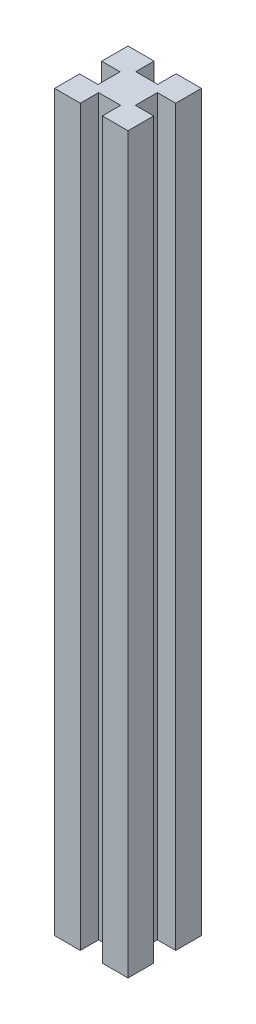
ISO-10303-21;
HEADER;
FILE_DESCRIPTION(('STEP AP214'),'2;1');
FILE_NAME('part.step','',(''),(''),'','','');
FILE_SCHEMA(('AUTOMOTIVE_DESIGN { 1 0 10303 214 1 1 1 1 }'));
ENDSEC;
DATA;
#1=APPLICATION_CONTEXT('core data for automotive mechanical design processes');
#2=APPLICATION_PROTOCOL_DEFINITION('international standard','automotive_design',2000,#1);
#3=PRODUCT_CONTEXT('',#1,'mechanical');
#4=PRODUCT('Part','Part','',(#3));
#5=PRODUCT_RELATED_PRODUCT_CATEGORY('part','',(#4));
#6=PRODUCT_DEFINITION_FORMATION('','',#4);
#7=PRODUCT_DEFINITION_CONTEXT('part definition',#1,'design');
#8=PRODUCT_DEFINITION('design','',#6,#7);
#9=PRODUCT_DEFINITION_SHAPE('','',#8);
#10=(LENGTH_UNIT() NAMED_UNIT(*) SI_UNIT(.MILLI.,.METRE.));
#11=(NAMED_UNIT(*) PLANE_ANGLE_UNIT() SI_UNIT($,.RADIAN.));
#12=(NAMED_UNIT(*) SI_UNIT($,.STERADIAN.) SOLID_ANGLE_UNIT());
#13=UNCERTAINTY_MEASURE_WITH_UNIT(LENGTH_MEASURE(1.E-05),#10,'distance_accuracy_value','');
#14=(GEOMETRIC_REPRESENTATION_CONTEXT(3) GLOBAL_UNCERTAINTY_ASSIGNED_CONTEXT((#13)) GLOBAL_UNIT_ASSIGNED_CONTEXT((#10,
#11,#12)) REPRESENTATION_CONTEXT('',''));
#15=CARTESIAN_POINT('',(0.,0.,0.));
#16=DIRECTION('',(0.,0.,1.));
#17=DIRECTION('',(1.,0.,0.));
#18=AXIS2_PLACEMENT_3D('',#15,#16,#17);
#19=CARTESIAN_POINT('',(0.,200.,0.));
#20=DIRECTION('',(1.,0.,0.));
#21=DIRECTION('',(0.,0.,-1.));
#22=AXIS2_PLACEMENT_3D('',#19,#20,#21);
#23=PLANE('',#22);
#24=DIRECTION('',(0.,1.,0.));
#25=VECTOR('',#24,1.);
#26=CARTESIAN_POINT('',(0.,0.,7.17807488292443));
#27=LINE('',#26,#25);
#28=CARTESIAN_POINT('',(0.,0.,7.17807488292443));
#29=VERTEX_POINT('',#28);
#30=CARTESIAN_POINT('',(0.,200.,7.17807488292443));
#31=VERTEX_POINT('',#30);
#32=EDGE_CURVE('E372',#29,#31,#27,.T.);
#33=ORIENTED_EDGE('',*,*,#32,.T.);
#34=DIRECTION('',(0.,0.,1.));
#35=VECTOR('',#34,1.);
#36=CARTESIAN_POINT('',(0.,200.,0.));
#37=LINE('',#36,#35);
#38=CARTESIAN_POINT('',(0.,200.,0.));
#39=VERTEX_POINT('',#38);
#40=EDGE_CURVE('E312',#39,#31,#37,.T.);
#41=ORIENTED_EDGE('',*,*,#40,.F.);
#42=DIRECTION('',(0.,-1.,0.));
#43=VECTOR('',#42,1.);
#44=CARTESIAN_POINT('',(0.,200.,0.));
#45=LINE('',#44,#43);
#46=CARTESIAN_POINT('',(0.,0.,0.));
#47=VERTEX_POINT('',#46);
#48=EDGE_CURVE('E219',#39,#47,#45,.T.);
#49=ORIENTED_EDGE('',*,*,#48,.T.);
#50=DIRECTION('',(0.,0.,1.));
#51=VECTOR('',#50,1.);
#52=CARTESIAN_POINT('',(0.,0.,0.));
#53=LINE('',#52,#51);
#54=EDGE_CURVE('E205',#47,#29,#53,.T.);
#55=ORIENTED_EDGE('',*,*,#54,.T.);
#56=EDGE_LOOP('',(#33,#41,#49,#55));
#57=FACE_BOUND('',#56,.T.);
#58=ADVANCED_FACE('F39',(#57),#23,.F.);
#59=CARTESIAN_POINT('',(0.,200.,20.));
#60=DIRECTION('',(0.,0.,-1.));
#61=DIRECTION('',(-1.,0.,0.));
#62=AXIS2_PLACEMENT_3D('',#59,#60,#61);
#63=PLANE('',#62);
#64=DIRECTION('',(0.,1.,0.));
#65=VECTOR('',#64,1.);
#66=CARTESIAN_POINT('',(7.,0.,20.));
#67=LINE('',#66,#65);
#68=CARTESIAN_POINT('',(7.,0.,20.));
#69=VERTEX_POINT('',#68);
#70=CARTESIAN_POINT('',(7.,200.,20.));
#71=VERTEX_POINT('',#70);
#72=EDGE_CURVE('E262',#69,#71,#67,.T.);
#73=ORIENTED_EDGE('',*,*,#72,.T.);
#74=DIRECTION('',(1.,0.,0.));
#75=VECTOR('',#74,1.);
#76=CARTESIAN_POINT('',(0.,200.,20.));
#77=LINE('',#76,#75);
#78=CARTESIAN_POINT('',(0.,200.,20.));
#79=VERTEX_POINT('',#78);
#80=EDGE_CURVE('E317',#79,#71,#77,.T.);
#81=ORIENTED_EDGE('',*,*,#80,.F.);
#82=DIRECTION('',(0.,-1.,0.));
#83=VECTOR('',#82,1.);
#84=CARTESIAN_POINT('',(0.,200.,20.));
#85=LINE('',#84,#83);
#86=CARTESIAN_POINT('',(0.,0.,20.));
#87=VERTEX_POINT('',#86);
#88=EDGE_CURVE('E11',#79,#87,#85,.T.);
#89=ORIENTED_EDGE('',*,*,#88,.T.);
#90=DIRECTION('',(1.,0.,0.));
#91=VECTOR('',#90,1.);
#92=CARTESIAN_POINT('',(0.,0.,20.));
#93=LINE('',#92,#91);
#94=EDGE_CURVE('E329',#87,#69,#93,.T.);
#95=ORIENTED_EDGE('',*,*,#94,.T.);
#96=EDGE_LOOP('',(#73,#81,#89,#95));
#97=FACE_BOUND('',#96,.T.);
#98=ADVANCED_FACE('F353',(#97),#63,.F.);
#99=CARTESIAN_POINT('',(20.,200.,0.));
#100=DIRECTION('',(-1.,0.,0.));
#101=DIRECTION('',(0.,0.,1.));
#102=AXIS2_PLACEMENT_3D('',#99,#100,#101);
#103=PLANE('',#102);
#104=DIRECTION('',(0.,1.,0.));
#105=VECTOR('',#104,1.);
#106=CARTESIAN_POINT('',(20.,0.,13.));
#107=LINE('',#106,#105);
#108=CARTESIAN_POINT('',(20.,0.,13.));
#109=VERTEX_POINT('',#108);
#110=CARTESIAN_POINT('',(20.,200.,13.));
#111=VERTEX_POINT('',#110);
#112=EDGE_CURVE('E273',#109,#111,#107,.T.);
#113=ORIENTED_EDGE('',*,*,#112,.T.);
#114=DIRECTION('',(0.,0.,-1.));
#115=VECTOR('',#114,1.);
#116=CARTESIAN_POINT('',(20.,200.,0.));
#117=LINE('',#116,#115);
#118=CARTESIAN_POINT('',(20.,200.,20.));
#119=VERTEX_POINT('',#118);
#120=EDGE_CURVE('E235',#119,#111,#117,.T.);
#121=ORIENTED_EDGE('',*,*,#120,.F.);
#122=DIRECTION('',(0.,-1.,0.));
#123=VECTOR('',#122,1.);
#124=CARTESIAN_POINT('',(20.,200.,20.));
#125=LINE('',#124,#123);
#126=CARTESIAN_POINT('',(20.,0.,20.));
#127=VERTEX_POINT('',#126);
#128=EDGE_CURVE('E48',#119,#127,#125,.T.);
#129=ORIENTED_EDGE('',*,*,#128,.T.);
#130=DIRECTION('',(0.,0.,-1.));
#131=VECTOR('',#130,1.);
#132=CARTESIAN_POINT('',(20.,0.,0.));
#133=LINE('',#132,#131);
#134=EDGE_CURVE('E208',#127,#109,#133,.T.);
#135=ORIENTED_EDGE('',*,*,#134,.T.);
#136=EDGE_LOOP('',(#113,#121,#129,#135));
#137=FACE_BOUND('',#136,.T.);
#138=ADVANCED_FACE('F233',(#137),#103,.F.);
#139=CARTESIAN_POINT('',(0.,200.,0.));
#140=DIRECTION('',(0.,0.,1.));
#141=DIRECTION('',(1.,0.,0.));
#142=AXIS2_PLACEMENT_3D('',#139,#140,#141);
#143=PLANE('',#142);
#144=DIRECTION('',(0.,1.,0.));
#145=VECTOR('',#144,1.);
#146=CARTESIAN_POINT('',(13.1122464142237,0.,0.));
#147=LINE('',#146,#145);
#148=CARTESIAN_POINT('',(13.1122464142237,0.,0.));
#149=VERTEX_POINT('',#148);
#150=CARTESIAN_POINT('',(13.1122464142237,200.,0.));
#151=VERTEX_POINT('',#150);
#152=EDGE_CURVE('E443',#149,#151,#147,.T.);
#153=ORIENTED_EDGE('',*,*,#152,.T.);
#154=DIRECTION('',(-1.,0.,0.));
#155=VECTOR('',#154,1.);
#156=CARTESIAN_POINT('',(0.,200.,0.));
#157=LINE('',#156,#155);
#158=CARTESIAN_POINT('',(20.,200.,0.));
#159=VERTEX_POINT('',#158);
#160=EDGE_CURVE('E223',#159,#151,#157,.T.);
#161=ORIENTED_EDGE('',*,*,#160,.F.);
#162=DIRECTION('',(0.,-1.,0.));
#163=VECTOR('',#162,1.);
#164=CARTESIAN_POINT('',(20.,200.,0.));
#165=LINE('',#164,#163);
#166=CARTESIAN_POINT('',(20.,0.,0.));
#167=VERTEX_POINT('',#166);
#168=EDGE_CURVE('E222',#159,#167,#165,.T.);
#169=ORIENTED_EDGE('',*,*,#168,.T.);
#170=DIRECTION('',(-1.,0.,0.));
#171=VECTOR('',#170,1.);
#172=CARTESIAN_POINT('',(0.,0.,0.));
#173=LINE('',#172,#171);
#174=EDGE_CURVE('E207',#167,#149,#173,.T.);
#175=ORIENTED_EDGE('',*,*,#174,.T.);
#176=EDGE_LOOP('',(#153,#161,#169,#175));
#177=FACE_BOUND('',#176,.T.);
#178=ADVANCED_FACE('F426',(#177),#143,.F.);
#179=CARTESIAN_POINT('',(0.,200.,0.));
#180=DIRECTION('',(0.,1.,0.));
#181=DIRECTION('',(0.,0.,1.));
#182=AXIS2_PLACEMENT_3D('',#179,#180,#181);
#183=PLANE('',#182);
#184=ORIENTED_EDGE('',*,*,#160,.T.);
#185=DIRECTION('',(0.,0.,1.));
#186=VECTOR('',#185,1.);
#187=CARTESIAN_POINT('',(13.1122464142237,200.,0.));
#188=LINE('',#187,#186);
#189=CARTESIAN_POINT('',(13.1122464142237,200.,5.));
#190=VERTEX_POINT('',#189);
#191=EDGE_CURVE('E188',#151,#190,#188,.T.);
#192=ORIENTED_EDGE('',*,*,#191,.T.);
#193=DIRECTION('',(1.,0.,0.));
#194=VECTOR('',#193,1.);
#195=CARTESIAN_POINT('',(0.,200.,5.));
#196=LINE('',#195,#194);
#197=CARTESIAN_POINT('',(7.11224641422371,200.,5.));
#198=VERTEX_POINT('',#197);
#199=EDGE_CURVE('E475',#198,#190,#196,.T.);
#200=ORIENTED_EDGE('',*,*,#199,.F.);
#201=DIRECTION('',(0.,0.,1.));
#202=VECTOR('',#201,1.);
#203=CARTESIAN_POINT('',(7.11224641422371,200.,0.));
#204=LINE('',#203,#202);
#205=CARTESIAN_POINT('',(7.11224641422371,200.,0.));
#206=VERTEX_POINT('',#205);
#207=EDGE_CURVE('E369',#206,#198,#204,.T.);
#208=ORIENTED_EDGE('',*,*,#207,.F.);
#209=EDGE_CURVE('E196',#206,#39,#157,.T.);
#210=ORIENTED_EDGE('',*,*,#209,.T.);
#211=ORIENTED_EDGE('',*,*,#40,.T.);
#212=DIRECTION('',(1.,0.,0.));
#213=VECTOR('',#212,1.);
#214=CARTESIAN_POINT('',(0.,200.,7.17807488292443));
#215=LINE('',#214,#213);
#216=CARTESIAN_POINT('',(5.,200.,7.17807488292443));
#217=VERTEX_POINT('',#216);
#218=EDGE_CURVE('E467',#31,#217,#215,.T.);
#219=ORIENTED_EDGE('',*,*,#218,.T.);
#220=DIRECTION('',(0.,0.,1.));
#221=VECTOR('',#220,1.);
#222=CARTESIAN_POINT('',(5.,200.,0.));
#223=LINE('',#222,#221);
#224=CARTESIAN_POINT('',(5.,200.,13.1780748829244));
#225=VERTEX_POINT('',#224);
#226=EDGE_CURVE('E272',#217,#225,#223,.T.);
#227=ORIENTED_EDGE('',*,*,#226,.T.);
#228=DIRECTION('',(1.,0.,0.));
#229=VECTOR('',#228,1.);
#230=CARTESIAN_POINT('',(0.,200.,13.1780748829244));
#231=LINE('',#230,#229);
#232=CARTESIAN_POINT('',(0.,200.,13.1780748829244));
#233=VERTEX_POINT('',#232);
#234=EDGE_CURVE('E359',#233,#225,#231,.T.);
#235=ORIENTED_EDGE('',*,*,#234,.F.);
#236=EDGE_CURVE('E213',#233,#79,#37,.T.);
#237=ORIENTED_EDGE('',*,*,#236,.T.);
#238=ORIENTED_EDGE('',*,*,#80,.T.);
#239=DIRECTION('',(0.,0.,-1.));
#240=VECTOR('',#239,1.);
#241=CARTESIAN_POINT('',(7.,200.,0.));
#242=LINE('',#241,#240);
#243=CARTESIAN_POINT('',(7.,200.,15.));
#244=VERTEX_POINT('',#243);
#245=EDGE_CURVE('E282',#71,#244,#242,.T.);
#246=ORIENTED_EDGE('',*,*,#245,.T.);
#247=DIRECTION('',(1.,0.,0.));
#248=VECTOR('',#247,1.);
#249=CARTESIAN_POINT('',(0.,200.,15.));
#250=LINE('',#249,#248);
#251=CARTESIAN_POINT('',(13.,200.,15.));
#252=VERTEX_POINT('',#251);
#253=EDGE_CURVE('E294',#244,#252,#250,.T.);
#254=ORIENTED_EDGE('',*,*,#253,.T.);
#255=DIRECTION('',(0.,0.,-1.));
#256=VECTOR('',#255,1.);
#257=CARTESIAN_POINT('',(13.,200.,0.));
#258=LINE('',#257,#256);
#259=CARTESIAN_POINT('',(13.,200.,20.));
#260=VERTEX_POINT('',#259);
#261=EDGE_CURVE('E290',#260,#252,#258,.T.);
#262=ORIENTED_EDGE('',*,*,#261,.F.);
#263=EDGE_CURVE('E316',#260,#119,#77,.T.);
#264=ORIENTED_EDGE('',*,*,#263,.T.);
#265=ORIENTED_EDGE('',*,*,#120,.T.);
#266=DIRECTION('',(-1.,0.,0.));
#267=VECTOR('',#266,1.);
#268=CARTESIAN_POINT('',(0.,200.,13.));
#269=LINE('',#268,#267);
#270=CARTESIAN_POINT('',(15.,200.,13.));
#271=VERTEX_POINT('',#270);
#272=EDGE_CURVE('E265',#111,#271,#269,.T.);
#273=ORIENTED_EDGE('',*,*,#272,.T.);
#274=DIRECTION('',(0.,0.,1.));
#275=VECTOR('',#274,1.);
#276=CARTESIAN_POINT('',(15.,200.,0.));
#277=LINE('',#276,#275);
#278=CARTESIAN_POINT('',(15.,200.,7.));
#279=VERTEX_POINT('',#278);
#280=EDGE_CURVE('E261',#279,#271,#277,.T.);
#281=ORIENTED_EDGE('',*,*,#280,.F.);
#282=DIRECTION('',(-1.,0.,0.));
#283=VECTOR('',#282,1.);
#284=CARTESIAN_POINT('',(0.,200.,7.));
#285=LINE('',#284,#283);
#286=CARTESIAN_POINT('',(20.,200.,7.));
#287=VERTEX_POINT('',#286);
#288=EDGE_CURVE('E257',#287,#279,#285,.T.);
#289=ORIENTED_EDGE('',*,*,#288,.F.);
#290=EDGE_CURVE('E321',#287,#159,#117,.T.);
#291=ORIENTED_EDGE('',*,*,#290,.T.);
#292=EDGE_LOOP('',(#184,#192,#200,#208,#210,#211,#219,#227,#235,#237,#238,#246,#254,#262,#264,
#265,#273,#281,#289,#291));
#293=FACE_BOUND('',#292,.T.);
#294=ADVANCED_FACE('F342',(#293),#183,.T.);
#295=CARTESIAN_POINT('',(0.,0.,0.));
#296=DIRECTION('',(0.,1.,0.));
#297=DIRECTION('',(0.,0.,1.));
#298=AXIS2_PLACEMENT_3D('',#295,#296,#297);
#299=PLANE('',#298);
#300=DIRECTION('',(0.,0.,1.));
#301=VECTOR('',#300,1.);
#302=CARTESIAN_POINT('',(13.1122464142237,0.,0.));
#303=LINE('',#302,#301);
#304=CARTESIAN_POINT('',(13.1122464142237,0.,5.));
#305=VERTEX_POINT('',#304);
#306=EDGE_CURVE('E198',#149,#305,#303,.T.);
#307=ORIENTED_EDGE('',*,*,#306,.F.);
#308=ORIENTED_EDGE('',*,*,#174,.F.);
#309=CARTESIAN_POINT('',(20.,0.,7.));
#310=VERTEX_POINT('',#309);
#311=EDGE_CURVE('E215',#310,#167,#133,.T.);
#312=ORIENTED_EDGE('',*,*,#311,.F.);
#313=DIRECTION('',(-1.,0.,0.));
#314=VECTOR('',#313,1.);
#315=CARTESIAN_POINT('',(0.,0.,7.));
#316=LINE('',#315,#314);
#317=CARTESIAN_POINT('',(15.,0.,7.));
#318=VERTEX_POINT('',#317);
#319=EDGE_CURVE('E253',#310,#318,#316,.T.);
#320=ORIENTED_EDGE('',*,*,#319,.T.);
#321=DIRECTION('',(0.,0.,1.));
#322=VECTOR('',#321,1.);
#323=CARTESIAN_POINT('',(15.,0.,0.));
#324=LINE('',#323,#322);
#325=CARTESIAN_POINT('',(15.,0.,13.));
#326=VERTEX_POINT('',#325);
#327=EDGE_CURVE('E245',#318,#326,#324,.T.);
#328=ORIENTED_EDGE('',*,*,#327,.T.);
#329=DIRECTION('',(-1.,0.,0.));
#330=VECTOR('',#329,1.);
#331=CARTESIAN_POINT('',(0.,0.,13.));
#332=LINE('',#331,#330);
#333=EDGE_CURVE('E243',#109,#326,#332,.T.);
#334=ORIENTED_EDGE('',*,*,#333,.F.);
#335=ORIENTED_EDGE('',*,*,#134,.F.);
#336=CARTESIAN_POINT('',(13.,0.,20.));
#337=VERTEX_POINT('',#336);
#338=EDGE_CURVE('E241',#337,#127,#93,.T.);
#339=ORIENTED_EDGE('',*,*,#338,.F.);
#340=DIRECTION('',(0.,0.,-1.));
#341=VECTOR('',#340,1.);
#342=CARTESIAN_POINT('',(13.,0.,0.));
#343=LINE('',#342,#341);
#344=CARTESIAN_POINT('',(13.,0.,15.));
#345=VERTEX_POINT('',#344);
#346=EDGE_CURVE('E278',#337,#345,#343,.T.);
#347=ORIENTED_EDGE('',*,*,#346,.T.);
#348=DIRECTION('',(1.,0.,0.));
#349=VECTOR('',#348,1.);
#350=CARTESIAN_POINT('',(0.,0.,15.));
#351=LINE('',#350,#349);
#352=CARTESIAN_POINT('',(7.,0.,15.));
#353=VERTEX_POINT('',#352);
#354=EDGE_CURVE('E281',#353,#345,#351,.T.);
#355=ORIENTED_EDGE('',*,*,#354,.F.);
#356=DIRECTION('',(0.,0.,-1.));
#357=VECTOR('',#356,1.);
#358=CARTESIAN_POINT('',(7.,0.,0.));
#359=LINE('',#358,#357);
#360=EDGE_CURVE('E286',#69,#353,#359,.T.);
#361=ORIENTED_EDGE('',*,*,#360,.F.);
#362=ORIENTED_EDGE('',*,*,#94,.F.);
#363=CARTESIAN_POINT('',(0.,0.,13.1780748829244));
#364=VERTEX_POINT('',#363);
#365=EDGE_CURVE('E328',#364,#87,#53,.T.);
#366=ORIENTED_EDGE('',*,*,#365,.F.);
#367=DIRECTION('',(1.,0.,0.));
#368=VECTOR('',#367,1.);
#369=CARTESIAN_POINT('',(0.,0.,13.1780748829244));
#370=LINE('',#369,#368);
#371=CARTESIAN_POINT('',(5.,0.,13.1780748829244));
#372=VERTEX_POINT('',#371);
#373=EDGE_CURVE('E382',#364,#372,#370,.T.);
#374=ORIENTED_EDGE('',*,*,#373,.T.);
#375=DIRECTION('',(0.,0.,1.));
#376=VECTOR('',#375,1.);
#377=CARTESIAN_POINT('',(5.,0.,0.));
#378=LINE('',#377,#376);
#379=CARTESIAN_POINT('',(5.,0.,7.17807488292443));
#380=VERTEX_POINT('',#379);
#381=EDGE_CURVE('E456',#380,#372,#378,.T.);
#382=ORIENTED_EDGE('',*,*,#381,.F.);
#383=DIRECTION('',(1.,0.,0.));
#384=VECTOR('',#383,1.);
#385=CARTESIAN_POINT('',(0.,0.,7.17807488292443));
#386=LINE('',#385,#384);
#387=EDGE_CURVE('E459',#29,#380,#386,.T.);
#388=ORIENTED_EDGE('',*,*,#387,.F.);
#389=ORIENTED_EDGE('',*,*,#54,.F.);
#390=CARTESIAN_POINT('',(7.11224641422371,0.,0.));
#391=VERTEX_POINT('',#390);
#392=EDGE_CURVE('E194',#391,#47,#173,.T.);
#393=ORIENTED_EDGE('',*,*,#392,.F.);
#394=DIRECTION('',(0.,0.,1.));
#395=VECTOR('',#394,1.);
#396=CARTESIAN_POINT('',(7.11224641422371,0.,0.));
#397=LINE('',#396,#395);
#398=CARTESIAN_POINT('',(7.11224641422371,0.,5.));
#399=VERTEX_POINT('',#398);
#400=EDGE_CURVE('E178',#391,#399,#397,.T.);
#401=ORIENTED_EDGE('',*,*,#400,.T.);
#402=DIRECTION('',(1.,0.,0.));
#403=VECTOR('',#402,1.);
#404=CARTESIAN_POINT('',(0.,0.,5.));
#405=LINE('',#404,#403);
#406=EDGE_CURVE('E55',#399,#305,#405,.T.);
#407=ORIENTED_EDGE('',*,*,#406,.T.);
#408=EDGE_LOOP('',(#307,#308,#312,#320,#328,#334,#335,#339,#347,#355,#361,#362,#366,#374,#382,
#388,#389,#393,#401,#407));
#409=FACE_BOUND('',#408,.T.);
#410=ADVANCED_FACE('F202',(#409),#299,.F.);
#411=ORIENTED_EDGE('',*,*,#236,.F.);
#412=DIRECTION('',(0.,1.,0.));
#413=VECTOR('',#412,1.);
#414=CARTESIAN_POINT('',(0.,0.,13.1780748829244));
#415=LINE('',#414,#413);
#416=EDGE_CURVE('E375',#364,#233,#415,.T.);
#417=ORIENTED_EDGE('',*,*,#416,.F.);
#418=ORIENTED_EDGE('',*,*,#365,.T.);
#419=ORIENTED_EDGE('',*,*,#88,.F.);
#420=EDGE_LOOP('',(#411,#417,#418,#419));
#421=FACE_BOUND('',#420,.T.);
#422=ADVANCED_FACE('F41',(#421),#23,.F.);
#423=ORIENTED_EDGE('',*,*,#263,.F.);
#424=DIRECTION('',(0.,1.,0.));
#425=VECTOR('',#424,1.);
#426=CARTESIAN_POINT('',(13.,0.,20.));
#427=LINE('',#426,#425);
#428=EDGE_CURVE('E289',#337,#260,#427,.T.);
#429=ORIENTED_EDGE('',*,*,#428,.F.);
#430=ORIENTED_EDGE('',*,*,#338,.T.);
#431=ORIENTED_EDGE('',*,*,#128,.F.);
#432=EDGE_LOOP('',(#423,#429,#430,#431));
#433=FACE_BOUND('',#432,.T.);
#434=ADVANCED_FACE('F337',(#433),#63,.F.);
#435=ORIENTED_EDGE('',*,*,#290,.F.);
#436=DIRECTION('',(0.,1.,0.));
#437=VECTOR('',#436,1.);
#438=CARTESIAN_POINT('',(20.,0.,7.));
#439=LINE('',#438,#437);
#440=EDGE_CURVE('E269',#310,#287,#439,.T.);
#441=ORIENTED_EDGE('',*,*,#440,.F.);
#442=ORIENTED_EDGE('',*,*,#311,.T.);
#443=ORIENTED_EDGE('',*,*,#168,.F.);
#444=EDGE_LOOP('',(#435,#441,#442,#443));
#445=FACE_BOUND('',#444,.T.);
#446=ADVANCED_FACE('F394',(#445),#103,.F.);
#447=ORIENTED_EDGE('',*,*,#209,.F.);
#448=DIRECTION('',(0.,1.,0.));
#449=VECTOR('',#448,1.);
#450=CARTESIAN_POINT('',(7.11224641422371,0.,0.));
#451=LINE('',#450,#449);
#452=EDGE_CURVE('E182',#391,#206,#451,.T.);
#453=ORIENTED_EDGE('',*,*,#452,.F.);
#454=ORIENTED_EDGE('',*,*,#392,.T.);
#455=ORIENTED_EDGE('',*,*,#48,.F.);
#456=EDGE_LOOP('',(#447,#453,#454,#455));
#457=FACE_BOUND('',#456,.T.);
#458=ADVANCED_FACE('F192',(#457),#143,.F.);
#459=CARTESIAN_POINT('',(7.,0.,0.));
#460=DIRECTION('',(1.,0.,0.));
#461=DIRECTION('',(0.,0.,-1.));
#462=AXIS2_PLACEMENT_3D('',#459,#460,#461);
#463=PLANE('',#462);
#464=ORIENTED_EDGE('',*,*,#245,.F.);
#465=ORIENTED_EDGE('',*,*,#72,.F.);
#466=ORIENTED_EDGE('',*,*,#360,.T.);
#467=DIRECTION('',(0.,1.,0.));
#468=VECTOR('',#467,1.);
#469=CARTESIAN_POINT('',(7.,0.,15.));
#470=LINE('',#469,#468);
#471=EDGE_CURVE('E304',#353,#244,#470,.T.);
#472=ORIENTED_EDGE('',*,*,#471,.T.);
#473=EDGE_LOOP('',(#464,#465,#466,#472));
#474=FACE_BOUND('',#473,.T.);
#475=ADVANCED_FACE('F351',(#474),#463,.T.);
#476=CARTESIAN_POINT('',(0.,0.,15.));
#477=DIRECTION('',(0.,0.,1.));
#478=DIRECTION('',(1.,0.,0.));
#479=AXIS2_PLACEMENT_3D('',#476,#477,#478);
#480=PLANE('',#479);
#481=ORIENTED_EDGE('',*,*,#253,.F.);
#482=ORIENTED_EDGE('',*,*,#471,.F.);
#483=ORIENTED_EDGE('',*,*,#354,.T.);
#484=DIRECTION('',(0.,1.,0.));
#485=VECTOR('',#484,1.);
#486=CARTESIAN_POINT('',(13.,0.,15.));
#487=LINE('',#486,#485);
#488=EDGE_CURVE('E307',#345,#252,#487,.T.);
#489=ORIENTED_EDGE('',*,*,#488,.T.);
#490=EDGE_LOOP('',(#481,#482,#483,#489));
#491=FACE_BOUND('',#490,.T.);
#492=ADVANCED_FACE('F346',(#491),#480,.T.);
#493=CARTESIAN_POINT('',(13.,0.,0.));
#494=DIRECTION('',(1.,0.,0.));
#495=DIRECTION('',(0.,0.,-1.));
#496=AXIS2_PLACEMENT_3D('',#493,#494,#495);
#497=PLANE('',#496);
#498=ORIENTED_EDGE('',*,*,#261,.T.);
#499=ORIENTED_EDGE('',*,*,#488,.F.);
#500=ORIENTED_EDGE('',*,*,#346,.F.);
#501=ORIENTED_EDGE('',*,*,#428,.T.);
#502=EDGE_LOOP('',(#498,#499,#500,#501));
#503=FACE_BOUND('',#502,.T.);
#504=ADVANCED_FACE('F340',(#503),#497,.F.);
#505=CARTESIAN_POINT('',(0.,0.,7.));
#506=DIRECTION('',(0.,0.,-1.));
#507=DIRECTION('',(-1.,0.,0.));
#508=AXIS2_PLACEMENT_3D('',#505,#506,#507);
#509=PLANE('',#508);
#510=ORIENTED_EDGE('',*,*,#288,.T.);
#511=DIRECTION('',(0.,1.,0.));
#512=VECTOR('',#511,1.);
#513=CARTESIAN_POINT('',(15.,0.,7.));
#514=LINE('',#513,#512);
#515=EDGE_CURVE('E248',#318,#279,#514,.T.);
#516=ORIENTED_EDGE('',*,*,#515,.F.);
#517=ORIENTED_EDGE('',*,*,#319,.F.);
#518=ORIENTED_EDGE('',*,*,#440,.T.);
#519=EDGE_LOOP('',(#510,#516,#517,#518));
#520=FACE_BOUND('',#519,.T.);
#521=ADVANCED_FACE('F390',(#520),#509,.F.);
#522=CARTESIAN_POINT('',(0.,0.,13.));
#523=DIRECTION('',(0.,0.,-1.));
#524=DIRECTION('',(-1.,0.,0.));
#525=AXIS2_PLACEMENT_3D('',#522,#523,#524);
#526=PLANE('',#525);
#527=ORIENTED_EDGE('',*,*,#272,.F.);
#528=ORIENTED_EDGE('',*,*,#112,.F.);
#529=ORIENTED_EDGE('',*,*,#333,.T.);
#530=DIRECTION('',(0.,1.,0.));
#531=VECTOR('',#530,1.);
#532=CARTESIAN_POINT('',(15.,0.,13.));
#533=LINE('',#532,#531);
#534=EDGE_CURVE('E63',#326,#271,#533,.T.);
#535=ORIENTED_EDGE('',*,*,#534,.T.);
#536=EDGE_LOOP('',(#527,#528,#529,#535));
#537=FACE_BOUND('',#536,.T.);
#538=ADVANCED_FACE('F402',(#537),#526,.T.);
#539=CARTESIAN_POINT('',(15.,0.,0.));
#540=DIRECTION('',(-1.,0.,0.));
#541=DIRECTION('',(0.,0.,1.));
#542=AXIS2_PLACEMENT_3D('',#539,#540,#541);
#543=PLANE('',#542);
#544=ORIENTED_EDGE('',*,*,#280,.T.);
#545=ORIENTED_EDGE('',*,*,#534,.F.);
#546=ORIENTED_EDGE('',*,*,#327,.F.);
#547=ORIENTED_EDGE('',*,*,#515,.T.);
#548=EDGE_LOOP('',(#544,#545,#546,#547));
#549=FACE_BOUND('',#548,.T.);
#550=ADVANCED_FACE('F399',(#549),#543,.F.);
#551=CARTESIAN_POINT('',(5.,0.,0.));
#552=DIRECTION('',(-1.,0.,0.));
#553=DIRECTION('',(0.,0.,1.));
#554=AXIS2_PLACEMENT_3D('',#551,#552,#553);
#555=PLANE('',#554);
#556=ORIENTED_EDGE('',*,*,#226,.F.);
#557=DIRECTION('',(0.,1.,0.));
#558=VECTOR('',#557,1.);
#559=CARTESIAN_POINT('',(5.,0.,7.17807488292443));
#560=LINE('',#559,#558);
#561=EDGE_CURVE('E376',#380,#217,#560,.T.);
#562=ORIENTED_EDGE('',*,*,#561,.F.);
#563=ORIENTED_EDGE('',*,*,#381,.T.);
#564=DIRECTION('',(0.,1.,0.));
#565=VECTOR('',#564,1.);
#566=CARTESIAN_POINT('',(5.,0.,13.1780748829244));
#567=LINE('',#566,#565);
#568=EDGE_CURVE('E380',#372,#225,#567,.T.);
#569=ORIENTED_EDGE('',*,*,#568,.T.);
#570=EDGE_LOOP('',(#556,#562,#563,#569));
#571=FACE_BOUND('',#570,.T.);
#572=ADVANCED_FACE('F401',(#571),#555,.T.);
#573=CARTESIAN_POINT('',(0.,0.,13.1780748829244));
#574=DIRECTION('',(0.,0.,1.));
#575=DIRECTION('',(1.,0.,0.));
#576=AXIS2_PLACEMENT_3D('',#573,#574,#575);
#577=PLANE('',#576);
#578=ORIENTED_EDGE('',*,*,#234,.T.);
#579=ORIENTED_EDGE('',*,*,#568,.F.);
#580=ORIENTED_EDGE('',*,*,#373,.F.);
#581=ORIENTED_EDGE('',*,*,#416,.T.);
#582=EDGE_LOOP('',(#578,#579,#580,#581));
#583=FACE_BOUND('',#582,.T.);
#584=ADVANCED_FACE('F408',(#583),#577,.F.);
#585=CARTESIAN_POINT('',(0.,0.,7.17807488292443));
#586=DIRECTION('',(0.,0.,1.));
#587=DIRECTION('',(1.,0.,0.));
#588=AXIS2_PLACEMENT_3D('',#585,#586,#587);
#589=PLANE('',#588);
#590=ORIENTED_EDGE('',*,*,#218,.F.);
#591=ORIENTED_EDGE('',*,*,#32,.F.);
#592=ORIENTED_EDGE('',*,*,#387,.T.);
#593=ORIENTED_EDGE('',*,*,#561,.T.);
#594=EDGE_LOOP('',(#590,#591,#592,#593));
#595=FACE_BOUND('',#594,.T.);
#596=ADVANCED_FACE('F493',(#595),#589,.T.);
#597=CARTESIAN_POINT('',(13.1122464142237,0.,0.));
#598=DIRECTION('',(-1.,0.,0.));
#599=DIRECTION('',(0.,0.,1.));
#600=AXIS2_PLACEMENT_3D('',#597,#598,#599);
#601=PLANE('',#600);
#602=ORIENTED_EDGE('',*,*,#191,.F.);
#603=ORIENTED_EDGE('',*,*,#152,.F.);
#604=ORIENTED_EDGE('',*,*,#306,.T.);
#605=DIRECTION('',(0.,1.,0.));
#606=VECTOR('',#605,1.);
#607=CARTESIAN_POINT('',(13.1122464142237,0.,5.));
#608=LINE('',#607,#606);
#609=EDGE_CURVE('E446',#305,#190,#608,.T.);
#610=ORIENTED_EDGE('',*,*,#609,.T.);
#611=EDGE_LOOP('',(#602,#603,#604,#610));
#612=FACE_BOUND('',#611,.T.);
#613=ADVANCED_FACE('F483',(#612),#601,.T.);
#614=CARTESIAN_POINT('',(0.,0.,5.));
#615=DIRECTION('',(0.,0.,1.));
#616=DIRECTION('',(1.,0.,0.));
#617=AXIS2_PLACEMENT_3D('',#614,#615,#616);
#618=PLANE('',#617);
#619=ORIENTED_EDGE('',*,*,#199,.T.);
#620=ORIENTED_EDGE('',*,*,#609,.F.);
#621=ORIENTED_EDGE('',*,*,#406,.F.);
#622=DIRECTION('',(0.,1.,0.));
#623=VECTOR('',#622,1.);
#624=CARTESIAN_POINT('',(7.11224641422371,0.,5.));
#625=LINE('',#624,#623);
#626=EDGE_CURVE('E184',#399,#198,#625,.T.);
#627=ORIENTED_EDGE('',*,*,#626,.T.);
#628=EDGE_LOOP('',(#619,#620,#621,#627));
#629=FACE_BOUND('',#628,.T.);
#630=ADVANCED_FACE('F484',(#629),#618,.F.);
#631=CARTESIAN_POINT('',(7.11224641422371,0.,0.));
#632=DIRECTION('',(-1.,0.,0.));
#633=DIRECTION('',(0.,0.,1.));
#634=AXIS2_PLACEMENT_3D('',#631,#632,#633);
#635=PLANE('',#634);
#636=ORIENTED_EDGE('',*,*,#207,.T.);
#637=ORIENTED_EDGE('',*,*,#626,.F.);
#638=ORIENTED_EDGE('',*,*,#400,.F.);
#639=ORIENTED_EDGE('',*,*,#452,.T.);
#640=EDGE_LOOP('',(#636,#637,#638,#639));
#641=FACE_BOUND('',#640,.T.);
#642=ADVANCED_FACE('F181',(#641),#635,.F.);
#643=CLOSED_SHELL('',(#58,#98,#138,#178,#294,#410,#422,#434,#446,#458,#475,#492,#504,#521,#538,
#550,#572,#584,#596,#613,#630,#642));
#644=MANIFOLD_SOLID_BREP('B2',#643);
#645=ADVANCED_BREP_SHAPE_REPRESENTATION('',(#18,#644),#14);
#646=SHAPE_DEFINITION_REPRESENTATION(#9,#645);
ENDSEC;
END-ISO-10303-21;
